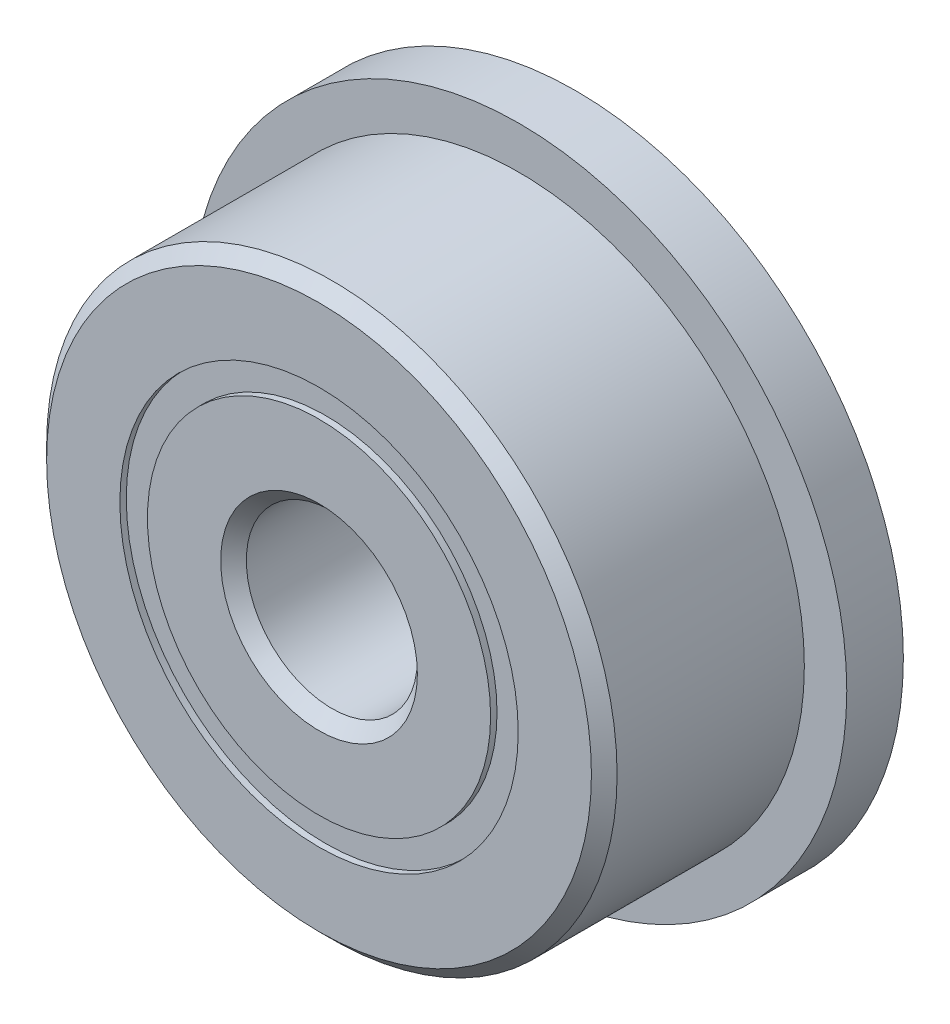
ISO-10303-21;
HEADER;
FILE_DESCRIPTION(('STEP AP214'),'2;1');
FILE_NAME('part.step','',(''),(''),'','','');
FILE_SCHEMA(('AUTOMOTIVE_DESIGN { 1 0 10303 214 1 1 1 1 }'));
ENDSEC;
DATA;
#1=APPLICATION_CONTEXT('core data for automotive mechanical design processes');
#2=APPLICATION_PROTOCOL_DEFINITION('international standard','automotive_design',2000,#1);
#3=PRODUCT_CONTEXT('',#1,'mechanical');
#4=PRODUCT('Part','Part','',(#3));
#5=PRODUCT_RELATED_PRODUCT_CATEGORY('part','',(#4));
#6=PRODUCT_DEFINITION_FORMATION('','',#4);
#7=PRODUCT_DEFINITION_CONTEXT('part definition',#1,'design');
#8=PRODUCT_DEFINITION('design','',#6,#7);
#9=PRODUCT_DEFINITION_SHAPE('','',#8);
#10=(LENGTH_UNIT() NAMED_UNIT(*) SI_UNIT(.MILLI.,.METRE.));
#11=(NAMED_UNIT(*) PLANE_ANGLE_UNIT() SI_UNIT($,.RADIAN.));
#12=(NAMED_UNIT(*) SI_UNIT($,.STERADIAN.) SOLID_ANGLE_UNIT());
#13=UNCERTAINTY_MEASURE_WITH_UNIT(LENGTH_MEASURE(1.E-05),#10,'distance_accuracy_value','');
#14=(GEOMETRIC_REPRESENTATION_CONTEXT(3) GLOBAL_UNCERTAINTY_ASSIGNED_CONTEXT((#13)) GLOBAL_UNIT_ASSIGNED_CONTEXT((#10,
#11,#12)) REPRESENTATION_CONTEXT('',''));
#15=CARTESIAN_POINT('',(0.,0.,0.));
#16=DIRECTION('',(0.,0.,1.));
#17=DIRECTION('',(1.,0.,0.));
#18=AXIS2_PLACEMENT_3D('',#15,#16,#17);
#19=CARTESIAN_POINT('',(0.,2.77129351648352,-1.696339));
#20=DIRECTION('',(0.,0.,1.));
#21=DIRECTION('',(1.,0.,0.));
#22=AXIS2_PLACEMENT_3D('',#19,#20,#21);
#23=PLANE('',#22);
#24=CARTESIAN_POINT('',(0.,0.,-1.696339));
#25=DIRECTION('',(0.,0.,1.));
#26=DIRECTION('',(1.,0.,0.));
#27=AXIS2_PLACEMENT_3D('',#24,#25,#26);
#28=CIRCLE('',#27,2.77129351648352);
#29=CARTESIAN_POINT('',(2.77129351648352,0.,-1.696339));
#30=VERTEX_POINT('',#29);
#31=EDGE_CURVE('E57',#30,#30,#28,.T.);
#32=ORIENTED_EDGE('',*,*,#31,.F.);
#33=EDGE_LOOP('',(#32));
#34=FACE_BOUND('',#33,.T.);
#35=CARTESIAN_POINT('',(0.,0.,-1.696339));
#36=DIRECTION('',(0.,0.,1.));
#37=DIRECTION('',(1.,0.,0.));
#38=AXIS2_PLACEMENT_3D('',#35,#36,#37);
#39=CIRCLE('',#38,2.38744648351648);
#40=CARTESIAN_POINT('',(2.38744648351648,0.,-1.696339));
#41=VERTEX_POINT('',#40);
#42=EDGE_CURVE('E11',#41,#41,#39,.T.);
#43=ORIENTED_EDGE('',*,*,#42,.T.);
#44=EDGE_LOOP('',(#43));
#45=FACE_BOUND('',#44,.T.);
#46=ADVANCED_FACE('F43',(#34,#45),#23,.F.);
#47=CARTESIAN_POINT('',(0.,0.,1.78562));
#48=DIRECTION('',(0.,0.,1.));
#49=DIRECTION('',(1.,0.,0.));
#50=AXIS2_PLACEMENT_3D('',#47,#48,#49);
#51=CYLINDRICAL_SURFACE('',#50,2.38744648351648);
#52=ORIENTED_EDGE('',*,*,#42,.F.);
#53=EDGE_LOOP('',(#52));
#54=FACE_BOUND('',#53,.T.);
#55=CARTESIAN_POINT('',(0.,0.,-0.816486193822563));
#56=DIRECTION('',(0.,0.,1.));
#57=DIRECTION('',(1.,0.,0.));
#58=AXIS2_PLACEMENT_3D('',#55,#56,#57);
#59=CIRCLE('',#58,2.38744648351648);
#60=CARTESIAN_POINT('',(2.38744648351648,0.,-0.816486193822563));
#61=VERTEX_POINT('',#60);
#62=EDGE_CURVE('E49',#61,#61,#59,.T.);
#63=ORIENTED_EDGE('',*,*,#62,.T.);
#64=EDGE_LOOP('',(#63));
#65=FACE_BOUND('',#64,.T.);
#66=ADVANCED_FACE('F66',(#54,#65),#51,.F.);
#67=CARTESIAN_POINT('',(0.,2.77129351648352,-0.816486193822563));
#68=DIRECTION('',(0.,0.,-1.));
#69=DIRECTION('',(-1.,0.,0.));
#70=AXIS2_PLACEMENT_3D('',#67,#68,#69);
#71=PLANE('',#70);
#72=ORIENTED_EDGE('',*,*,#62,.F.);
#73=EDGE_LOOP('',(#72));
#74=FACE_BOUND('',#73,.T.);
#75=CARTESIAN_POINT('',(0.,0.,-0.816486193822563));
#76=DIRECTION('',(0.,0.,1.));
#77=DIRECTION('',(1.,0.,0.));
#78=AXIS2_PLACEMENT_3D('',#75,#76,#77);
#79=CIRCLE('',#78,2.77129351648352);
#80=CARTESIAN_POINT('',(2.77129351648352,0.,-0.816486193822563));
#81=VERTEX_POINT('',#80);
#82=EDGE_CURVE('E53',#81,#81,#79,.T.);
#83=ORIENTED_EDGE('',*,*,#82,.T.);
#84=EDGE_LOOP('',(#83));
#85=FACE_BOUND('',#84,.T.);
#86=ADVANCED_FACE('F70',(#74,#85),#71,.F.);
#87=CARTESIAN_POINT('',(0.,0.,1.78562));
#88=DIRECTION('',(0.,0.,1.));
#89=DIRECTION('',(1.,0.,0.));
#90=AXIS2_PLACEMENT_3D('',#87,#88,#89);
#91=CYLINDRICAL_SURFACE('',#90,2.77129351648352);
#92=ORIENTED_EDGE('',*,*,#82,.F.);
#93=EDGE_LOOP('',(#92));
#94=FACE_BOUND('',#93,.T.);
#95=ORIENTED_EDGE('',*,*,#31,.T.);
#96=EDGE_LOOP('',(#95));
#97=FACE_BOUND('',#96,.T.);
#98=ADVANCED_FACE('F63',(#94,#97),#91,.T.);
#99=CLOSED_SHELL('',(#46,#66,#86,#98));
#100=MANIFOLD_SOLID_BREP('B2',#99);
#101=CARTESIAN_POINT('',(0.,2.77129351648352,1.696339));
#102=DIRECTION('',(0.,0.,-1.));
#103=DIRECTION('',(-1.,0.,0.));
#104=AXIS2_PLACEMENT_3D('',#101,#102,#103);
#105=PLANE('',#104);
#106=CARTESIAN_POINT('',(0.,0.,1.696339));
#107=DIRECTION('',(0.,0.,1.));
#108=DIRECTION('',(1.,0.,0.));
#109=AXIS2_PLACEMENT_3D('',#106,#107,#108);
#110=CIRCLE('',#109,2.38744648351648);
#111=CARTESIAN_POINT('',(2.38744648351648,0.,1.696339));
#112=VERTEX_POINT('',#111);
#113=EDGE_CURVE('E42',#112,#112,#110,.T.);
#114=ORIENTED_EDGE('',*,*,#113,.F.);
#115=EDGE_LOOP('',(#114));
#116=FACE_BOUND('',#115,.T.);
#117=CARTESIAN_POINT('',(0.,0.,1.696339));
#118=DIRECTION('',(0.,0.,1.));
#119=DIRECTION('',(1.,0.,0.));
#120=AXIS2_PLACEMENT_3D('',#117,#118,#119);
#121=CIRCLE('',#120,2.77129351648352);
#122=CARTESIAN_POINT('',(2.77129351648352,0.,1.696339));
#123=VERTEX_POINT('',#122);
#124=EDGE_CURVE('E124',#123,#123,#121,.T.);
#125=ORIENTED_EDGE('',*,*,#124,.T.);
#126=EDGE_LOOP('',(#125));
#127=FACE_BOUND('',#126,.T.);
#128=ADVANCED_FACE('F110',(#116,#127),#105,.F.);
#129=CARTESIAN_POINT('',(0.,0.,1.78562));
#130=DIRECTION('',(0.,0.,1.));
#131=DIRECTION('',(1.,0.,0.));
#132=AXIS2_PLACEMENT_3D('',#129,#130,#131);
#133=CYLINDRICAL_SURFACE('',#132,2.38744648351648);
#134=CARTESIAN_POINT('',(0.,0.,0.816486193822562));
#135=DIRECTION('',(0.,0.,1.));
#136=DIRECTION('',(1.,0.,0.));
#137=AXIS2_PLACEMENT_3D('',#134,#135,#136);
#138=CIRCLE('',#137,2.38744648351648);
#139=CARTESIAN_POINT('',(2.38744648351648,0.,0.816486193822562));
#140=VERTEX_POINT('',#139);
#141=EDGE_CURVE('E116',#140,#140,#138,.T.);
#142=ORIENTED_EDGE('',*,*,#141,.F.);
#143=EDGE_LOOP('',(#142));
#144=FACE_BOUND('',#143,.T.);
#145=ORIENTED_EDGE('',*,*,#113,.T.);
#146=EDGE_LOOP('',(#145));
#147=FACE_BOUND('',#146,.T.);
#148=ADVANCED_FACE('F139',(#144,#147),#133,.F.);
#149=CARTESIAN_POINT('',(0.,2.77129351648352,0.816486193822562));
#150=DIRECTION('',(0.,0.,1.));
#151=DIRECTION('',(1.,0.,0.));
#152=AXIS2_PLACEMENT_3D('',#149,#150,#151);
#153=PLANE('',#152);
#154=CARTESIAN_POINT('',(0.,0.,0.816486193822562));
#155=DIRECTION('',(0.,0.,1.));
#156=DIRECTION('',(1.,0.,0.));
#157=AXIS2_PLACEMENT_3D('',#154,#155,#156);
#158=CIRCLE('',#157,2.77129351648352);
#159=CARTESIAN_POINT('',(2.77129351648352,0.,0.816486193822562));
#160=VERTEX_POINT('',#159);
#161=EDGE_CURVE('E120',#160,#160,#158,.T.);
#162=ORIENTED_EDGE('',*,*,#161,.F.);
#163=EDGE_LOOP('',(#162));
#164=FACE_BOUND('',#163,.T.);
#165=ORIENTED_EDGE('',*,*,#141,.T.);
#166=EDGE_LOOP('',(#165));
#167=FACE_BOUND('',#166,.T.);
#168=ADVANCED_FACE('F134',(#164,#167),#153,.F.);
#169=CARTESIAN_POINT('',(0.,0.,1.78562));
#170=DIRECTION('',(0.,0.,1.));
#171=DIRECTION('',(1.,0.,0.));
#172=AXIS2_PLACEMENT_3D('',#169,#170,#171);
#173=CYLINDRICAL_SURFACE('',#172,2.77129351648352);
#174=ORIENTED_EDGE('',*,*,#124,.F.);
#175=EDGE_LOOP('',(#174));
#176=FACE_BOUND('',#175,.T.);
#177=ORIENTED_EDGE('',*,*,#161,.T.);
#178=EDGE_LOOP('',(#177));
#179=FACE_BOUND('',#178,.T.);
#180=ADVANCED_FACE('F131',(#176,#179),#173,.T.);
#181=CLOSED_SHELL('',(#128,#148,#168,#180));
#182=MANIFOLD_SOLID_BREP('B6',#181);
#183=CARTESIAN_POINT('',(-1.28968499999997,2.23379994575948,0.));
#184=DIRECTION('',(0.,0.,1.));
#185=DIRECTION('',(-0.499999999999989,0.866025403784445,0.));
#186=AXIS2_PLACEMENT_3D('',#183,#184,#185);
#187=SPHERICAL_SURFACE('',#186,0.816486193822563);
#188=CARTESIAN_POINT('',(-1.28968499999997,2.23379994575948,0.816486193822562));
#189=VERTEX_POINT('',#188);
#190=VERTEX_LOOP('',#189);
#191=FACE_BOUND('',#190,.T.);
#192=ADVANCED_FACE('F177',(#191),#187,.T.);
#193=CLOSED_SHELL('',(#192));
#194=MANIFOLD_SOLID_BREP('B37',#193);
#195=CARTESIAN_POINT('',(-2.23379994575945,1.28968500000003,0.));
#196=DIRECTION('',(0.,0.,1.));
#197=DIRECTION('',(-0.866025403784433,0.50000000000001,0.));
#198=AXIS2_PLACEMENT_3D('',#195,#196,#197);
#199=SPHERICAL_SURFACE('',#198,0.816486193822563);
#200=CARTESIAN_POINT('',(-2.23379994575945,1.28968500000003,0.816486193822562));
#201=VERTEX_POINT('',#200);
#202=VERTEX_LOOP('',#201);
#203=FACE_BOUND('',#202,.T.);
#204=ADVANCED_FACE('F197',(#203),#199,.T.);
#205=CLOSED_SHELL('',(#204));
#206=MANIFOLD_SOLID_BREP('B106',#205);
#207=CARTESIAN_POINT('',(-2.57937,0.,0.));
#208=DIRECTION('',(0.,0.,1.));
#209=DIRECTION('',(-1.,0.,0.));
#210=AXIS2_PLACEMENT_3D('',#207,#208,#209);
#211=SPHERICAL_SURFACE('',#210,0.816486193822563);
#212=CARTESIAN_POINT('',(-2.57937,0.,0.816486193822562));
#213=VERTEX_POINT('',#212);
#214=VERTEX_LOOP('',#213);
#215=FACE_BOUND('',#214,.T.);
#216=ADVANCED_FACE('F217',(#215),#211,.T.);
#217=CLOSED_SHELL('',(#216));
#218=MANIFOLD_SOLID_BREP('B173',#217);
#219=CARTESIAN_POINT('',(-2.23379994575948,-1.28968499999998,0.));
#220=DIRECTION('',(0.,0.,1.));
#221=DIRECTION('',(-0.866025403784443,-0.499999999999992,0.));
#222=AXIS2_PLACEMENT_3D('',#219,#220,#221);
#223=SPHERICAL_SURFACE('',#222,0.816486193822563);
#224=CARTESIAN_POINT('',(-2.23379994575948,-1.28968499999998,0.816486193822562));
#225=VERTEX_POINT('',#224);
#226=VERTEX_LOOP('',#225);
#227=FACE_BOUND('',#226,.T.);
#228=ADVANCED_FACE('F237',(#227),#223,.T.);
#229=CLOSED_SHELL('',(#228));
#230=MANIFOLD_SOLID_BREP('B193',#229);
#231=CARTESIAN_POINT('',(-1.28968500000002,-2.23379994575946,0.));
#232=DIRECTION('',(0.,0.,1.));
#233=DIRECTION('',(-0.500000000000007,-0.866025403784435,0.));
#234=AXIS2_PLACEMENT_3D('',#231,#232,#233);
#235=SPHERICAL_SURFACE('',#234,0.816486193822563);
#236=CARTESIAN_POINT('',(-1.28968500000002,-2.23379994575946,0.816486193822562));
#237=VERTEX_POINT('',#236);
#238=VERTEX_LOOP('',#237);
#239=FACE_BOUND('',#238,.T.);
#240=ADVANCED_FACE('F257',(#239),#235,.T.);
#241=CLOSED_SHELL('',(#240));
#242=MANIFOLD_SOLID_BREP('B213',#241);
#243=CARTESIAN_POINT('',(0.,-2.57937,0.));
#244=DIRECTION('',(0.,0.,1.));
#245=DIRECTION('',(0.,-1.,0.));
#246=AXIS2_PLACEMENT_3D('',#243,#244,#245);
#247=SPHERICAL_SURFACE('',#246,0.816486193822563);
#248=CARTESIAN_POINT('',(0.,-2.57937,0.816486193822562));
#249=VERTEX_POINT('',#248);
#250=VERTEX_LOOP('',#249);
#251=FACE_BOUND('',#250,.T.);
#252=ADVANCED_FACE('F277',(#251),#247,.T.);
#253=CLOSED_SHELL('',(#252));
#254=MANIFOLD_SOLID_BREP('B233',#253);
#255=CARTESIAN_POINT('',(1.28968499999999,-2.23379994575948,0.));
#256=DIRECTION('',(0.,0.,1.));
#257=DIRECTION('',(0.499999999999995,-0.866025403784442,0.));
#258=AXIS2_PLACEMENT_3D('',#255,#256,#257);
#259=SPHERICAL_SURFACE('',#258,0.816486193822563);
#260=CARTESIAN_POINT('',(1.28968499999999,-2.23379994575948,0.816486193822562));
#261=VERTEX_POINT('',#260);
#262=VERTEX_LOOP('',#261);
#263=FACE_BOUND('',#262,.T.);
#264=ADVANCED_FACE('F297',(#263),#259,.T.);
#265=CLOSED_SHELL('',(#264));
#266=MANIFOLD_SOLID_BREP('B253',#265);
#267=CARTESIAN_POINT('',(2.23379994575946,-1.28968500000001,0.));
#268=DIRECTION('',(0.,0.,1.));
#269=DIRECTION('',(0.866025403784436,-0.500000000000004,0.));
#270=AXIS2_PLACEMENT_3D('',#267,#268,#269);
#271=SPHERICAL_SURFACE('',#270,0.816486193822563);
#272=CARTESIAN_POINT('',(2.23379994575946,-1.28968500000001,0.816486193822562));
#273=VERTEX_POINT('',#272);
#274=VERTEX_LOOP('',#273);
#275=FACE_BOUND('',#274,.T.);
#276=ADVANCED_FACE('F317',(#275),#271,.T.);
#277=CLOSED_SHELL('',(#276));
#278=MANIFOLD_SOLID_BREP('B273',#277);
#279=CARTESIAN_POINT('',(2.57937,0.,0.));
#280=DIRECTION('',(0.,0.,1.));
#281=DIRECTION('',(1.,0.,0.));
#282=AXIS2_PLACEMENT_3D('',#279,#280,#281);
#283=SPHERICAL_SURFACE('',#282,0.816486193822563);
#284=CARTESIAN_POINT('',(2.57937,0.,0.816486193822562));
#285=VERTEX_POINT('',#284);
#286=VERTEX_LOOP('',#285);
#287=FACE_BOUND('',#286,.T.);
#288=ADVANCED_FACE('F337',(#287),#283,.T.);
#289=CLOSED_SHELL('',(#288));
#290=MANIFOLD_SOLID_BREP('B293',#289);
#291=CARTESIAN_POINT('',(2.23379994575947,1.28968499999999,0.));
#292=DIRECTION('',(0.,0.,1.));
#293=DIRECTION('',(0.86602540378444,0.499999999999998,0.));
#294=AXIS2_PLACEMENT_3D('',#291,#292,#293);
#295=SPHERICAL_SURFACE('',#294,0.816486193822563);
#296=CARTESIAN_POINT('',(2.23379994575947,1.28968499999999,0.816486193822562));
#297=VERTEX_POINT('',#296);
#298=VERTEX_LOOP('',#297);
#299=FACE_BOUND('',#298,.T.);
#300=ADVANCED_FACE('F357',(#299),#295,.T.);
#301=CLOSED_SHELL('',(#300));
#302=MANIFOLD_SOLID_BREP('B313',#301);
#303=CARTESIAN_POINT('',(1.289685,2.23379994575947,0.));
#304=DIRECTION('',(0.,0.,1.));
#305=DIRECTION('',(0.500000000000001,0.866025403784438,0.));
#306=AXIS2_PLACEMENT_3D('',#303,#304,#305);
#307=SPHERICAL_SURFACE('',#306,0.816486193822563);
#308=CARTESIAN_POINT('',(1.289685,2.23379994575947,0.816486193822562));
#309=VERTEX_POINT('',#308);
#310=VERTEX_LOOP('',#309);
#311=FACE_BOUND('',#310,.T.);
#312=ADVANCED_FACE('F377',(#311),#307,.T.);
#313=CLOSED_SHELL('',(#312));
#314=MANIFOLD_SOLID_BREP('B333',#313);
#315=CARTESIAN_POINT('',(0.,2.57937,0.));
#316=DIRECTION('',(0.,0.,1.));
#317=DIRECTION('',(0.,1.,0.));
#318=AXIS2_PLACEMENT_3D('',#315,#316,#317);
#319=SPHERICAL_SURFACE('',#318,0.816486193822563);
#320=CARTESIAN_POINT('',(0.,2.57937,0.816486193822562));
#321=VERTEX_POINT('',#320);
#322=VERTEX_LOOP('',#321);
#323=FACE_BOUND('',#322,.T.);
#324=ADVANCED_FACE('F399',(#323),#319,.T.);
#325=CLOSED_SHELL('',(#324));
#326=MANIFOLD_SOLID_BREP('B353',#325);
#327=CARTESIAN_POINT('',(0.,2.38744648351648,1.78562));
#328=DIRECTION('',(0.,0.,-1.));
#329=DIRECTION('',(-1.,0.,0.));
#330=AXIS2_PLACEMENT_3D('',#327,#328,#329);
#331=PLANE('',#330);
#332=CARTESIAN_POINT('',(0.,0.,1.78562));
#333=DIRECTION('',(0.,0.,1.));
#334=DIRECTION('',(1.,0.,0.));
#335=AXIS2_PLACEMENT_3D('',#332,#333,#334);
#336=CIRCLE('',#335,1.368552);
#337=CARTESIAN_POINT('',(1.368552,0.,1.78562));
#338=VERTEX_POINT('',#337);
#339=EDGE_CURVE('E446',#338,#338,#336,.T.);
#340=ORIENTED_EDGE('',*,*,#339,.F.);
#341=EDGE_LOOP('',(#340));
#342=FACE_BOUND('',#341,.T.);
#343=CARTESIAN_POINT('',(0.,0.,1.78562));
#344=DIRECTION('',(0.,0.,1.));
#345=DIRECTION('',(1.,0.,0.));
#346=AXIS2_PLACEMENT_3D('',#343,#344,#345);
#347=CIRCLE('',#346,2.38744648351648);
#348=CARTESIAN_POINT('',(2.38744648351648,0.,1.78562));
#349=VERTEX_POINT('',#348);
#350=EDGE_CURVE('E398',#349,#349,#347,.T.);
#351=ORIENTED_EDGE('',*,*,#350,.T.);
#352=EDGE_LOOP('',(#351));
#353=FACE_BOUND('',#352,.T.);
#354=ADVANCED_FACE('F418',(#342,#353),#331,.F.);
#355=CARTESIAN_POINT('',(0.,0.,1.78562));
#356=DIRECTION('',(0.,0.,1.));
#357=DIRECTION('',(1.,0.,0.));
#358=AXIS2_PLACEMENT_3D('',#355,#356,#357);
#359=CYLINDRICAL_SURFACE('',#358,2.38744648351648);
#360=ORIENTED_EDGE('',*,*,#350,.F.);
#361=EDGE_LOOP('',(#360));
#362=FACE_BOUND('',#361,.T.);
#363=CARTESIAN_POINT('',(0.,0.,0.793608888888889));
#364=DIRECTION('',(0.,0.,1.));
#365=DIRECTION('',(1.,0.,0.));
#366=AXIS2_PLACEMENT_3D('',#363,#364,#365);
#367=CIRCLE('',#366,2.38744648351648);
#368=CARTESIAN_POINT('',(2.38744648351648,0.,0.793608888888889));
#369=VERTEX_POINT('',#368);
#370=EDGE_CURVE('E424',#369,#369,#367,.T.);
#371=ORIENTED_EDGE('',*,*,#370,.T.);
#372=EDGE_LOOP('',(#371));
#373=FACE_BOUND('',#372,.T.);
#374=ADVANCED_FACE('F453',(#362,#373),#359,.T.);
#375=CARTESIAN_POINT('',(0.,0.,0.));
#376=DIRECTION('',(0.,0.,1.));
#377=DIRECTION('',(1.,0.,0.));
#378=AXIS2_PLACEMENT_3D('',#375,#376,#377);
#379=TOROIDAL_SURFACE('',#378,2.57937,0.816486193822561);
#380=ORIENTED_EDGE('',*,*,#370,.F.);
#381=EDGE_LOOP('',(#380));
#382=FACE_BOUND('',#381,.T.);
#383=CARTESIAN_POINT('',(0.,0.,-0.79360888888889));
#384=DIRECTION('',(0.,0.,1.));
#385=DIRECTION('',(1.,0.,0.));
#386=AXIS2_PLACEMENT_3D('',#383,#384,#385);
#387=CIRCLE('',#386,2.38744648351648);
#388=CARTESIAN_POINT('',(2.38744648351648,0.,-0.79360888888889));
#389=VERTEX_POINT('',#388);
#390=EDGE_CURVE('E428',#389,#389,#387,.T.);
#391=ORIENTED_EDGE('',*,*,#390,.T.);
#392=EDGE_LOOP('',(#391));
#393=FACE_BOUND('',#392,.T.);
#394=ADVANCED_FACE('F457',(#382,#393),#379,.F.);
#395=CARTESIAN_POINT('',(0.,0.,1.78562));
#396=DIRECTION('',(0.,0.,1.));
#397=DIRECTION('',(1.,0.,0.));
#398=AXIS2_PLACEMENT_3D('',#395,#396,#397);
#399=CYLINDRICAL_SURFACE('',#398,2.38744648351648);
#400=ORIENTED_EDGE('',*,*,#390,.F.);
#401=EDGE_LOOP('',(#400));
#402=FACE_BOUND('',#401,.T.);
#403=CARTESIAN_POINT('',(0.,0.,-1.78562));
#404=DIRECTION('',(0.,0.,1.));
#405=DIRECTION('',(1.,0.,0.));
#406=AXIS2_PLACEMENT_3D('',#403,#404,#405);
#407=CIRCLE('',#406,2.38744648351648);
#408=CARTESIAN_POINT('',(2.38744648351648,0.,-1.78562));
#409=VERTEX_POINT('',#408);
#410=EDGE_CURVE('E432',#409,#409,#407,.T.);
#411=ORIENTED_EDGE('',*,*,#410,.T.);
#412=EDGE_LOOP('',(#411));
#413=FACE_BOUND('',#412,.T.);
#414=ADVANCED_FACE('F462',(#402,#413),#399,.T.);
#415=CARTESIAN_POINT('',(0.,1.368552,-1.78562));
#416=DIRECTION('',(0.,0.,1.));
#417=DIRECTION('',(1.,0.,0.));
#418=AXIS2_PLACEMENT_3D('',#415,#416,#417);
#419=PLANE('',#418);
#420=ORIENTED_EDGE('',*,*,#410,.F.);
#421=EDGE_LOOP('',(#420));
#422=FACE_BOUND('',#421,.T.);
#423=CARTESIAN_POINT('',(0.,0.,-1.78562));
#424=DIRECTION('',(0.,0.,1.));
#425=DIRECTION('',(1.,0.,0.));
#426=AXIS2_PLACEMENT_3D('',#423,#424,#425);
#427=CIRCLE('',#426,1.368552);
#428=CARTESIAN_POINT('',(1.368552,0.,-1.78562));
#429=VERTEX_POINT('',#428);
#430=EDGE_CURVE('E437',#429,#429,#427,.T.);
#431=ORIENTED_EDGE('',*,*,#430,.T.);
#432=EDGE_LOOP('',(#431));
#433=FACE_BOUND('',#432,.T.);
#434=ADVANCED_FACE('F468',(#422,#433),#419,.F.);
#435=CARTESIAN_POINT('',(0.,0.,-1.607058));
#436=DIRECTION('',(0.,0.,-1.));
#437=DIRECTION('',(-1.,0.,0.));
#438=AXIS2_PLACEMENT_3D('',#435,#436,#437);
#439=CONICAL_SURFACE('',#438,1.18999,0.785398163397447);
#440=ORIENTED_EDGE('',*,*,#430,.F.);
#441=EDGE_LOOP('',(#440));
#442=FACE_BOUND('',#441,.T.);
#443=CARTESIAN_POINT('',(0.,0.,-1.607058));
#444=DIRECTION('',(0.,0.,1.));
#445=DIRECTION('',(1.,0.,0.));
#446=AXIS2_PLACEMENT_3D('',#443,#444,#445);
#447=CIRCLE('',#446,1.18999);
#448=CARTESIAN_POINT('',(1.18999,0.,-1.607058));
#449=VERTEX_POINT('',#448);
#450=EDGE_CURVE('E440',#449,#449,#447,.T.);
#451=ORIENTED_EDGE('',*,*,#450,.T.);
#452=EDGE_LOOP('',(#451));
#453=FACE_BOUND('',#452,.T.);
#454=ADVANCED_FACE('F472',(#442,#453),#439,.F.);
#455=CARTESIAN_POINT('',(0.,0.,1.78562));
#456=DIRECTION('',(0.,0.,1.));
#457=DIRECTION('',(1.,0.,0.));
#458=AXIS2_PLACEMENT_3D('',#455,#456,#457);
#459=CYLINDRICAL_SURFACE('',#458,1.18999);
#460=ORIENTED_EDGE('',*,*,#450,.F.);
#461=EDGE_LOOP('',(#460));
#462=FACE_BOUND('',#461,.T.);
#463=CARTESIAN_POINT('',(0.,0.,1.607058));
#464=DIRECTION('',(0.,0.,1.));
#465=DIRECTION('',(1.,0.,0.));
#466=AXIS2_PLACEMENT_3D('',#463,#464,#465);
#467=CIRCLE('',#466,1.18999);
#468=CARTESIAN_POINT('',(1.18999,0.,1.607058));
#469=VERTEX_POINT('',#468);
#470=EDGE_CURVE('E443',#469,#469,#467,.T.);
#471=ORIENTED_EDGE('',*,*,#470,.T.);
#472=EDGE_LOOP('',(#471));
#473=FACE_BOUND('',#472,.T.);
#474=ADVANCED_FACE('F476',(#462,#473),#459,.F.);
#475=CARTESIAN_POINT('',(0.,0.,1.78562));
#476=DIRECTION('',(0.,0.,1.));
#477=DIRECTION('',(1.,0.,0.));
#478=AXIS2_PLACEMENT_3D('',#475,#476,#477);
#479=CONICAL_SURFACE('',#478,1.368552,0.78539816339745);
#480=ORIENTED_EDGE('',*,*,#470,.F.);
#481=EDGE_LOOP('',(#480));
#482=FACE_BOUND('',#481,.T.);
#483=ORIENTED_EDGE('',*,*,#339,.T.);
#484=EDGE_LOOP('',(#483));
#485=FACE_BOUND('',#484,.T.);
#486=ADVANCED_FACE('F450',(#482,#485),#479,.F.);
#487=CLOSED_SHELL('',(#354,#374,#394,#414,#434,#454,#474,#486));
#488=MANIFOLD_SOLID_BREP('B373',#487);
#489=CARTESIAN_POINT('',(0.,0.,1.607058));
#490=DIRECTION('',(0.,0.,-1.));
#491=DIRECTION('',(-1.,0.,0.));
#492=AXIS2_PLACEMENT_3D('',#489,#490,#491);
#493=CONICAL_SURFACE('',#492,3.96875,0.785398163397447);
#494=CARTESIAN_POINT('',(0.,0.,1.78562));
#495=DIRECTION('',(0.,0.,1.));
#496=DIRECTION('',(1.,0.,0.));
#497=AXIS2_PLACEMENT_3D('',#494,#495,#496);
#498=CIRCLE('',#497,3.790188);
#499=CARTESIAN_POINT('',(3.790188,0.,1.78562));
#500=VERTEX_POINT('',#499);
#501=EDGE_CURVE('E561',#500,#500,#498,.T.);
#502=ORIENTED_EDGE('',*,*,#501,.F.);
#503=EDGE_LOOP('',(#502));
#504=FACE_BOUND('',#503,.T.);
#505=CARTESIAN_POINT('',(0.,0.,1.607058));
#506=DIRECTION('',(0.,0.,1.));
#507=DIRECTION('',(1.,0.,0.));
#508=AXIS2_PLACEMENT_3D('',#505,#506,#507);
#509=CIRCLE('',#508,3.96875);
#510=CARTESIAN_POINT('',(3.96875,0.,1.607058));
#511=VERTEX_POINT('',#510);
#512=EDGE_CURVE('E417',#511,#511,#509,.T.);
#513=ORIENTED_EDGE('',*,*,#512,.T.);
#514=EDGE_LOOP('',(#513));
#515=FACE_BOUND('',#514,.T.);
#516=ADVANCED_FACE('F539',(#504,#515),#493,.T.);
#517=CARTESIAN_POINT('',(0.,0.,1.78562));
#518=DIRECTION('',(0.,0.,1.));
#519=DIRECTION('',(1.,0.,0.));
#520=AXIS2_PLACEMENT_3D('',#517,#518,#519);
#521=CYLINDRICAL_SURFACE('',#520,3.96875);
#522=CARTESIAN_POINT('',(0.,0.,-0.99822));
#523=DIRECTION('',(0.,0.,1.));
#524=DIRECTION('',(1.,0.,0.));
#525=AXIS2_PLACEMENT_3D('',#522,#523,#524);
#526=CIRCLE('',#525,3.96875);
#527=CARTESIAN_POINT('',(3.96875,0.,-0.99822));
#528=VERTEX_POINT('',#527);
#529=EDGE_CURVE('E564',#528,#528,#526,.T.);
#530=ORIENTED_EDGE('',*,*,#529,.T.);
#531=EDGE_LOOP('',(#530));
#532=FACE_BOUND('',#531,.T.);
#533=ORIENTED_EDGE('',*,*,#512,.F.);
#534=EDGE_LOOP('',(#533));
#535=FACE_BOUND('',#534,.T.);
#536=ADVANCED_FACE('F584',(#532,#535),#521,.T.);
#537=CARTESIAN_POINT('',(0.,3.790188,-1.78562));
#538=DIRECTION('',(0.,0.,1.));
#539=DIRECTION('',(1.,0.,0.));
#540=AXIS2_PLACEMENT_3D('',#537,#538,#539);
#541=PLANE('',#540);
#542=CARTESIAN_POINT('',(0.,0.,-1.78562));
#543=DIRECTION('',(0.,0.,1.));
#544=DIRECTION('',(1.,0.,0.));
#545=AXIS2_PLACEMENT_3D('',#542,#543,#544);
#546=CIRCLE('',#545,2.77129351648352);
#547=CARTESIAN_POINT('',(2.77129351648352,0.,-1.78562));
#548=VERTEX_POINT('',#547);
#549=EDGE_CURVE('E545',#548,#548,#546,.T.);
#550=ORIENTED_EDGE('',*,*,#549,.T.);
#551=EDGE_LOOP('',(#550));
#552=FACE_BOUND('',#551,.T.);
#553=CARTESIAN_POINT('',(0.,0.,-1.78562));
#554=DIRECTION('',(0.,0.,-1.));
#555=DIRECTION('',(-1.,0.,0.));
#556=AXIS2_PLACEMENT_3D('',#553,#554,#555);
#557=CIRCLE('',#556,4.5593);
#558=CARTESIAN_POINT('',(-4.5593,0.,-1.78562));
#559=VERTEX_POINT('',#558);
#560=EDGE_CURVE('E567',#559,#559,#557,.T.);
#561=ORIENTED_EDGE('',*,*,#560,.T.);
#562=EDGE_LOOP('',(#561));
#563=FACE_BOUND('',#562,.T.);
#564=ADVANCED_FACE('F587',(#552,#563),#541,.F.);
#565=CARTESIAN_POINT('',(0.,0.,1.78562));
#566=DIRECTION('',(0.,0.,1.));
#567=DIRECTION('',(1.,0.,0.));
#568=AXIS2_PLACEMENT_3D('',#565,#566,#567);
#569=CYLINDRICAL_SURFACE('',#568,2.77129351648352);
#570=CARTESIAN_POINT('',(0.,0.,-0.793608888888889));
#571=DIRECTION('',(0.,0.,1.));
#572=DIRECTION('',(1.,0.,0.));
#573=AXIS2_PLACEMENT_3D('',#570,#571,#572);
#574=CIRCLE('',#573,2.77129351648352);
#575=CARTESIAN_POINT('',(2.77129351648352,0.,-0.793608888888889));
#576=VERTEX_POINT('',#575);
#577=EDGE_CURVE('E549',#576,#576,#574,.T.);
#578=ORIENTED_EDGE('',*,*,#577,.T.);
#579=EDGE_LOOP('',(#578));
#580=FACE_BOUND('',#579,.T.);
#581=ORIENTED_EDGE('',*,*,#549,.F.);
#582=EDGE_LOOP('',(#581));
#583=FACE_BOUND('',#582,.T.);
#584=ADVANCED_FACE('F592',(#580,#583),#569,.F.);
#585=CARTESIAN_POINT('',(0.,0.,0.));
#586=DIRECTION('',(0.,0.,1.));
#587=DIRECTION('',(1.,0.,0.));
#588=AXIS2_PLACEMENT_3D('',#585,#586,#587);
#589=TOROIDAL_SURFACE('',#588,2.57937,0.816486193822563);
#590=ORIENTED_EDGE('',*,*,#577,.F.);
#591=EDGE_LOOP('',(#590));
#592=FACE_BOUND('',#591,.T.);
#593=CARTESIAN_POINT('',(0.,0.,0.793608888888889));
#594=DIRECTION('',(0.,0.,1.));
#595=DIRECTION('',(1.,0.,0.));
#596=AXIS2_PLACEMENT_3D('',#593,#594,#595);
#597=CIRCLE('',#596,2.77129351648352);
#598=CARTESIAN_POINT('',(2.77129351648352,0.,0.793608888888889));
#599=VERTEX_POINT('',#598);
#600=EDGE_CURVE('E553',#599,#599,#597,.T.);
#601=ORIENTED_EDGE('',*,*,#600,.T.);
#602=EDGE_LOOP('',(#601));
#603=FACE_BOUND('',#602,.T.);
#604=ADVANCED_FACE('F598',(#592,#603),#589,.F.);
#605=CARTESIAN_POINT('',(0.,0.,1.78562));
#606=DIRECTION('',(0.,0.,1.));
#607=DIRECTION('',(1.,0.,0.));
#608=AXIS2_PLACEMENT_3D('',#605,#606,#607);
#609=CYLINDRICAL_SURFACE('',#608,2.77129351648352);
#610=ORIENTED_EDGE('',*,*,#600,.F.);
#611=EDGE_LOOP('',(#610));
#612=FACE_BOUND('',#611,.T.);
#613=CARTESIAN_POINT('',(0.,0.,1.78562));
#614=DIRECTION('',(0.,0.,1.));
#615=DIRECTION('',(1.,0.,0.));
#616=AXIS2_PLACEMENT_3D('',#613,#614,#615);
#617=CIRCLE('',#616,2.77129351648352);
#618=CARTESIAN_POINT('',(2.77129351648352,0.,1.78562));
#619=VERTEX_POINT('',#618);
#620=EDGE_CURVE('E558',#619,#619,#617,.T.);
#621=ORIENTED_EDGE('',*,*,#620,.T.);
#622=EDGE_LOOP('',(#621));
#623=FACE_BOUND('',#622,.T.);
#624=ADVANCED_FACE('F602',(#612,#623),#609,.F.);
#625=CARTESIAN_POINT('',(0.,3.790188,1.78562));
#626=DIRECTION('',(0.,0.,-1.));
#627=DIRECTION('',(-1.,0.,0.));
#628=AXIS2_PLACEMENT_3D('',#625,#626,#627);
#629=PLANE('',#628);
#630=ORIENTED_EDGE('',*,*,#620,.F.);
#631=EDGE_LOOP('',(#630));
#632=FACE_BOUND('',#631,.T.);
#633=ORIENTED_EDGE('',*,*,#501,.T.);
#634=EDGE_LOOP('',(#633));
#635=FACE_BOUND('',#634,.T.);
#636=ADVANCED_FACE('F580',(#632,#635),#629,.F.);
#637=CARTESIAN_POINT('',(0.,2.77129351648352,-0.99822));
#638=DIRECTION('',(0.,0.,1.));
#639=DIRECTION('',(1.,0.,0.));
#640=AXIS2_PLACEMENT_3D('',#637,#638,#639);
#641=PLANE('',#640);
#642=CARTESIAN_POINT('',(0.,0.,-0.99822));
#643=DIRECTION('',(0.,0.,-1.));
#644=DIRECTION('',(-1.,0.,0.));
#645=AXIS2_PLACEMENT_3D('',#642,#643,#644);
#646=CIRCLE('',#645,4.5593);
#647=CARTESIAN_POINT('',(-4.5593,0.,-0.99822));
#648=VERTEX_POINT('',#647);
#649=EDGE_CURVE('E570',#648,#648,#646,.T.);
#650=ORIENTED_EDGE('',*,*,#649,.F.);
#651=EDGE_LOOP('',(#650));
#652=FACE_BOUND('',#651,.T.);
#653=ORIENTED_EDGE('',*,*,#529,.F.);
#654=EDGE_LOOP('',(#653));
#655=FACE_BOUND('',#654,.T.);
#656=ADVANCED_FACE('F577',(#652,#655),#641,.T.);
#657=CARTESIAN_POINT('',(0.,0.,-1.78562));
#658=DIRECTION('',(0.,0.,-1.));
#659=DIRECTION('',(-1.,0.,0.));
#660=AXIS2_PLACEMENT_3D('',#657,#658,#659);
#661=CYLINDRICAL_SURFACE('',#660,4.5593);
#662=ORIENTED_EDGE('',*,*,#649,.T.);
#663=EDGE_LOOP('',(#662));
#664=FACE_BOUND('',#663,.T.);
#665=ORIENTED_EDGE('',*,*,#560,.F.);
#666=EDGE_LOOP('',(#665));
#667=FACE_BOUND('',#666,.T.);
#668=ADVANCED_FACE('F574',(#664,#667),#661,.T.);
#669=CLOSED_SHELL('',(#516,#536,#564,#584,#604,#624,#636,#656,#668));
#670=MANIFOLD_SOLID_BREP('B393',#669);
#671=ADVANCED_BREP_SHAPE_REPRESENTATION('',(#18,#100,#182,#194,#206,#218,#230,#242,#254,#266,
#278,#290,#302,#314,#326,#488,#670),#14);
#672=SHAPE_DEFINITION_REPRESENTATION(#9,#671);
ENDSEC;
END-ISO-10303-21;
